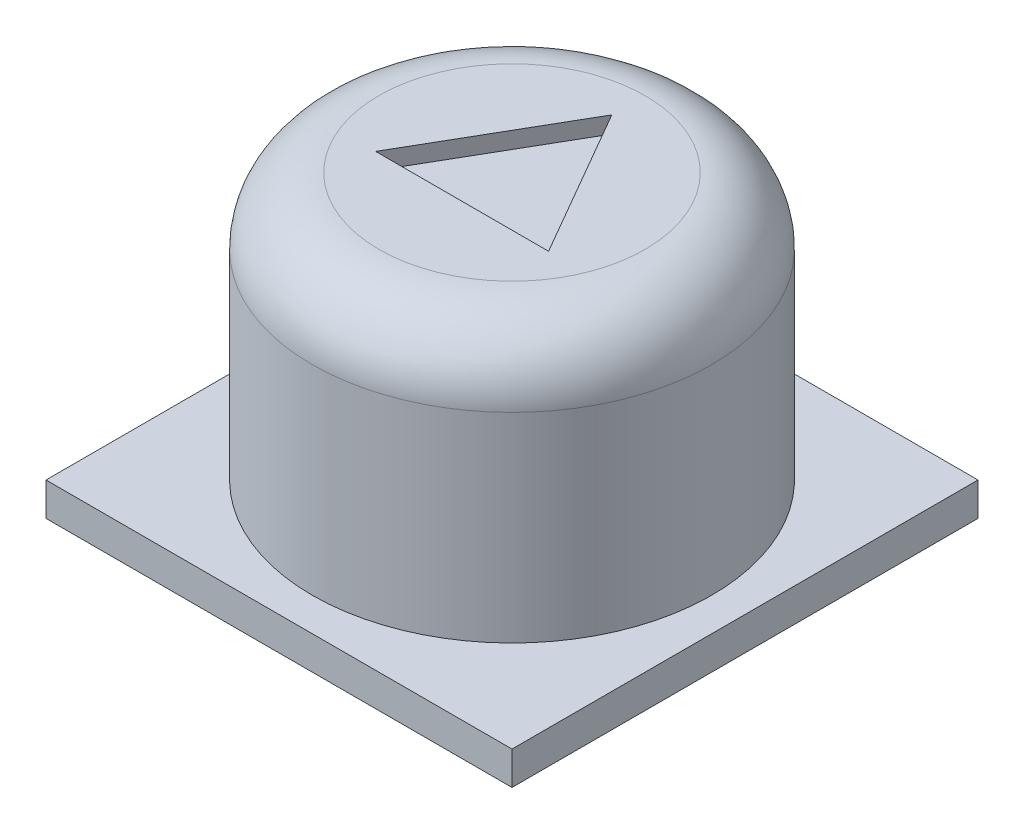
ISO-10303-21;
HEADER;
FILE_DESCRIPTION(('STEP AP214'),'2;1');
FILE_NAME('part.step','',(''),(''),'','','');
FILE_SCHEMA(('AUTOMOTIVE_DESIGN { 1 0 10303 214 1 1 1 1 }'));
ENDSEC;
DATA;
#1=APPLICATION_CONTEXT('core data for automotive mechanical design processes');
#2=APPLICATION_PROTOCOL_DEFINITION('international standard','automotive_design',2000,#1);
#3=PRODUCT_CONTEXT('',#1,'mechanical');
#4=PRODUCT('Part','Part','',(#3));
#5=PRODUCT_RELATED_PRODUCT_CATEGORY('part','',(#4));
#6=PRODUCT_DEFINITION_FORMATION('','',#4);
#7=PRODUCT_DEFINITION_CONTEXT('part definition',#1,'design');
#8=PRODUCT_DEFINITION('design','',#6,#7);
#9=PRODUCT_DEFINITION_SHAPE('','',#8);
#10=(LENGTH_UNIT() NAMED_UNIT(*) SI_UNIT(.MILLI.,.METRE.));
#11=(NAMED_UNIT(*) PLANE_ANGLE_UNIT() SI_UNIT($,.RADIAN.));
#12=(NAMED_UNIT(*) SI_UNIT($,.STERADIAN.) SOLID_ANGLE_UNIT());
#13=UNCERTAINTY_MEASURE_WITH_UNIT(LENGTH_MEASURE(1.E-05),#10,'distance_accuracy_value','');
#14=(GEOMETRIC_REPRESENTATION_CONTEXT(3) GLOBAL_UNCERTAINTY_ASSIGNED_CONTEXT((#13)) GLOBAL_UNIT_ASSIGNED_CONTEXT((#10,
#11,#12)) REPRESENTATION_CONTEXT('',''));
#15=CARTESIAN_POINT('',(0.,0.,0.));
#16=DIRECTION('',(0.,0.,1.));
#17=DIRECTION('',(1.,0.,0.));
#18=AXIS2_PLACEMENT_3D('',#15,#16,#17);
#19=CARTESIAN_POINT('',(0.,0.,0.));
#20=DIRECTION('',(0.,1.,0.));
#21=DIRECTION('',(0.,0.,1.));
#22=AXIS2_PLACEMENT_3D('',#19,#20,#21);
#23=PLANE('',#22);
#24=DIRECTION('',(0.,0.,1.));
#25=VECTOR('',#24,1.);
#26=CARTESIAN_POINT('',(-7.,0.,7.));
#27=LINE('',#26,#25);
#28=CARTESIAN_POINT('',(-7.,0.,-7.));
#29=VERTEX_POINT('',#28);
#30=CARTESIAN_POINT('',(-7.,0.,7.));
#31=VERTEX_POINT('',#30);
#32=EDGE_CURVE('E236',#29,#31,#27,.T.);
#33=ORIENTED_EDGE('',*,*,#32,.F.);
#34=DIRECTION('',(-1.,0.,0.));
#35=VECTOR('',#34,1.);
#36=CARTESIAN_POINT('',(7.,0.,-7.));
#37=LINE('',#36,#35);
#38=CARTESIAN_POINT('',(7.,0.,-7.));
#39=VERTEX_POINT('',#38);
#40=EDGE_CURVE('E241',#39,#29,#37,.T.);
#41=ORIENTED_EDGE('',*,*,#40,.F.);
#42=DIRECTION('',(0.,0.,-1.));
#43=VECTOR('',#42,1.);
#44=CARTESIAN_POINT('',(7.,0.,7.));
#45=LINE('',#44,#43);
#46=CARTESIAN_POINT('',(7.,0.,7.));
#47=VERTEX_POINT('',#46);
#48=EDGE_CURVE('E252',#47,#39,#45,.T.);
#49=ORIENTED_EDGE('',*,*,#48,.F.);
#50=DIRECTION('',(1.,0.,0.));
#51=VECTOR('',#50,1.);
#52=CARTESIAN_POINT('',(7.,0.,7.));
#53=LINE('',#52,#51);
#54=EDGE_CURVE('E250',#31,#47,#53,.T.);
#55=ORIENTED_EDGE('',*,*,#54,.F.);
#56=EDGE_LOOP('',(#33,#41,#49,#55));
#57=FACE_BOUND('',#56,.T.);
#58=DIRECTION('',(0.,0.,-1.));
#59=VECTOR('',#58,1.);
#60=CARTESIAN_POINT('',(-3.,0.,-3.));
#61=LINE('',#60,#59);
#62=CARTESIAN_POINT('',(-3.,0.,3.));
#63=VERTEX_POINT('',#62);
#64=CARTESIAN_POINT('',(-3.,0.,-3.));
#65=VERTEX_POINT('',#64);
#66=EDGE_CURVE('E195',#63,#65,#61,.T.);
#67=ORIENTED_EDGE('',*,*,#66,.F.);
#68=DIRECTION('',(-1.,0.,0.));
#69=VECTOR('',#68,1.);
#70=CARTESIAN_POINT('',(3.,0.,3.));
#71=LINE('',#70,#69);
#72=CARTESIAN_POINT('',(3.,0.,3.));
#73=VERTEX_POINT('',#72);
#74=EDGE_CURVE('E205',#73,#63,#71,.T.);
#75=ORIENTED_EDGE('',*,*,#74,.F.);
#76=DIRECTION('',(0.,0.,1.));
#77=VECTOR('',#76,1.);
#78=CARTESIAN_POINT('',(3.,0.,-3.));
#79=LINE('',#78,#77);
#80=CARTESIAN_POINT('',(3.,0.,-3.));
#81=VERTEX_POINT('',#80);
#82=EDGE_CURVE('E217',#81,#73,#79,.T.);
#83=ORIENTED_EDGE('',*,*,#82,.F.);
#84=DIRECTION('',(1.,0.,0.));
#85=VECTOR('',#84,1.);
#86=CARTESIAN_POINT('',(3.,0.,-3.));
#87=LINE('',#86,#85);
#88=EDGE_CURVE('E214',#65,#81,#87,.T.);
#89=ORIENTED_EDGE('',*,*,#88,.F.);
#90=EDGE_LOOP('',(#67,#75,#83,#89));
#91=FACE_BOUND('',#90,.T.);
#92=ADVANCED_FACE('F34',(#57,#91),#23,.F.);
#93=CARTESIAN_POINT('',(0.,1.,0.));
#94=DIRECTION('',(0.,1.,0.));
#95=DIRECTION('',(0.,0.,1.));
#96=AXIS2_PLACEMENT_3D('',#93,#94,#95);
#97=PLANE('',#96);
#98=DIRECTION('',(0.,0.,1.));
#99=VECTOR('',#98,1.);
#100=CARTESIAN_POINT('',(-7.,1.,7.));
#101=LINE('',#100,#99);
#102=CARTESIAN_POINT('',(-7.,1.,-7.));
#103=VERTEX_POINT('',#102);
#104=CARTESIAN_POINT('',(-7.,1.,7.));
#105=VERTEX_POINT('',#104);
#106=EDGE_CURVE('E237',#103,#105,#101,.T.);
#107=ORIENTED_EDGE('',*,*,#106,.T.);
#108=DIRECTION('',(1.,0.,0.));
#109=VECTOR('',#108,1.);
#110=CARTESIAN_POINT('',(7.,1.,7.));
#111=LINE('',#110,#109);
#112=CARTESIAN_POINT('',(7.,1.,7.));
#113=VERTEX_POINT('',#112);
#114=EDGE_CURVE('E240',#105,#113,#111,.T.);
#115=ORIENTED_EDGE('',*,*,#114,.T.);
#116=DIRECTION('',(0.,0.,-1.));
#117=VECTOR('',#116,1.);
#118=CARTESIAN_POINT('',(7.,1.,7.));
#119=LINE('',#118,#117);
#120=CARTESIAN_POINT('',(7.,1.,-7.));
#121=VERTEX_POINT('',#120);
#122=EDGE_CURVE('E243',#113,#121,#119,.T.);
#123=ORIENTED_EDGE('',*,*,#122,.T.);
#124=DIRECTION('',(-1.,0.,0.));
#125=VECTOR('',#124,1.);
#126=CARTESIAN_POINT('',(7.,1.,-7.));
#127=LINE('',#126,#125);
#128=EDGE_CURVE('E245',#121,#103,#127,.T.);
#129=ORIENTED_EDGE('',*,*,#128,.T.);
#130=EDGE_LOOP('',(#107,#115,#123,#129));
#131=FACE_BOUND('',#130,.T.);
#132=CARTESIAN_POINT('',(0.,1.,0.));
#133=DIRECTION('',(0.,1.,0.));
#134=DIRECTION('',(0.,0.,1.));
#135=AXIS2_PLACEMENT_3D('',#132,#133,#134);
#136=CIRCLE('',#135,6.);
#137=CARTESIAN_POINT('',(0.,1.,6.));
#138=VERTEX_POINT('',#137);
#139=EDGE_CURVE('E233',#138,#138,#136,.T.);
#140=ORIENTED_EDGE('',*,*,#139,.F.);
#141=EDGE_LOOP('',(#140));
#142=FACE_BOUND('',#141,.T.);
#143=ADVANCED_FACE('F284',(#131,#142),#97,.T.);
#144=CARTESIAN_POINT('',(-7.,1.,7.));
#145=DIRECTION('',(1.,0.,0.));
#146=DIRECTION('',(0.,0.,-1.));
#147=AXIS2_PLACEMENT_3D('',#144,#145,#146);
#148=PLANE('',#147);
#149=ORIENTED_EDGE('',*,*,#32,.T.);
#150=DIRECTION('',(0.,-1.,0.));
#151=VECTOR('',#150,1.);
#152=CARTESIAN_POINT('',(-7.,1.,7.));
#153=LINE('',#152,#151);
#154=EDGE_CURVE('E263',#105,#31,#153,.T.);
#155=ORIENTED_EDGE('',*,*,#154,.F.);
#156=ORIENTED_EDGE('',*,*,#106,.F.);
#157=DIRECTION('',(0.,-1.,0.));
#158=VECTOR('',#157,1.);
#159=CARTESIAN_POINT('',(-7.,1.,-7.));
#160=LINE('',#159,#158);
#161=EDGE_CURVE('E247',#103,#29,#160,.T.);
#162=ORIENTED_EDGE('',*,*,#161,.T.);
#163=EDGE_LOOP('',(#149,#155,#156,#162));
#164=FACE_BOUND('',#163,.T.);
#165=ADVANCED_FACE('F290',(#164),#148,.F.);
#166=CARTESIAN_POINT('',(7.,1.,7.));
#167=DIRECTION('',(0.,0.,-1.));
#168=DIRECTION('',(-1.,0.,0.));
#169=AXIS2_PLACEMENT_3D('',#166,#167,#168);
#170=PLANE('',#169);
#171=ORIENTED_EDGE('',*,*,#54,.T.);
#172=DIRECTION('',(0.,-1.,0.));
#173=VECTOR('',#172,1.);
#174=CARTESIAN_POINT('',(7.,1.,7.));
#175=LINE('',#174,#173);
#176=EDGE_CURVE('E260',#113,#47,#175,.T.);
#177=ORIENTED_EDGE('',*,*,#176,.F.);
#178=ORIENTED_EDGE('',*,*,#114,.F.);
#179=ORIENTED_EDGE('',*,*,#154,.T.);
#180=EDGE_LOOP('',(#171,#177,#178,#179));
#181=FACE_BOUND('',#180,.T.);
#182=ADVANCED_FACE('F305',(#181),#170,.F.);
#183=CARTESIAN_POINT('',(7.,1.,7.));
#184=DIRECTION('',(-1.,0.,0.));
#185=DIRECTION('',(0.,0.,1.));
#186=AXIS2_PLACEMENT_3D('',#183,#184,#185);
#187=PLANE('',#186);
#188=ORIENTED_EDGE('',*,*,#48,.T.);
#189=DIRECTION('',(0.,-1.,0.));
#190=VECTOR('',#189,1.);
#191=CARTESIAN_POINT('',(7.,1.,-7.));
#192=LINE('',#191,#190);
#193=EDGE_CURVE('E257',#121,#39,#192,.T.);
#194=ORIENTED_EDGE('',*,*,#193,.F.);
#195=ORIENTED_EDGE('',*,*,#122,.F.);
#196=ORIENTED_EDGE('',*,*,#176,.T.);
#197=EDGE_LOOP('',(#188,#194,#195,#196));
#198=FACE_BOUND('',#197,.T.);
#199=ADVANCED_FACE('F301',(#198),#187,.F.);
#200=CARTESIAN_POINT('',(7.,1.,-7.));
#201=DIRECTION('',(0.,0.,1.));
#202=DIRECTION('',(1.,0.,0.));
#203=AXIS2_PLACEMENT_3D('',#200,#201,#202);
#204=PLANE('',#203);
#205=ORIENTED_EDGE('',*,*,#40,.T.);
#206=ORIENTED_EDGE('',*,*,#161,.F.);
#207=ORIENTED_EDGE('',*,*,#128,.F.);
#208=ORIENTED_EDGE('',*,*,#193,.T.);
#209=EDGE_LOOP('',(#205,#206,#207,#208));
#210=FACE_BOUND('',#209,.T.);
#211=ADVANCED_FACE('F297',(#210),#204,.F.);
#212=CARTESIAN_POINT('',(0.,9.,0.));
#213=DIRECTION('',(0.,-1.,0.));
#214=DIRECTION('',(0.,0.,-1.));
#215=AXIS2_PLACEMENT_3D('',#212,#213,#214);
#216=CYLINDRICAL_SURFACE('',#215,6.);
#217=CARTESIAN_POINT('',(0.,7.,0.));
#218=DIRECTION('',(0.,1.,0.));
#219=DIRECTION('',(0.,0.,1.));
#220=AXIS2_PLACEMENT_3D('',#217,#218,#219);
#221=CIRCLE('',#220,6.);
#222=CARTESIAN_POINT('',(0.,7.,6.));
#223=VERTEX_POINT('',#222);
#224=EDGE_CURVE('E11',#223,#223,#221,.F.);
#225=ORIENTED_EDGE('',*,*,#224,.T.);
#226=EDGE_LOOP('',(#225));
#227=FACE_BOUND('',#226,.T.);
#228=ORIENTED_EDGE('',*,*,#139,.T.);
#229=EDGE_LOOP('',(#228));
#230=FACE_BOUND('',#229,.T.);
#231=ADVANCED_FACE('F300',(#227,#230),#216,.T.);
#232=CARTESIAN_POINT('',(0.,9.,0.));
#233=DIRECTION('',(0.,1.,0.));
#234=DIRECTION('',(0.,0.,1.));
#235=AXIS2_PLACEMENT_3D('',#232,#233,#234);
#236=PLANE('',#235);
#237=DIRECTION('',(-0.5,0.,-0.866025403784438));
#238=VECTOR('',#237,1.);
#239=CARTESIAN_POINT('',(2.59807621135333,9.,1.50000000000001));
#240=LINE('',#239,#238);
#241=CARTESIAN_POINT('',(2.59807621135333,9.,1.50000000000001));
#242=VERTEX_POINT('',#241);
#243=CARTESIAN_POINT('',(0.,9.,-3.00000000000001));
#244=VERTEX_POINT('',#243);
#245=EDGE_CURVE('E49',#242,#244,#240,.T.);
#246=ORIENTED_EDGE('',*,*,#245,.F.);
#247=DIRECTION('',(1.,0.,0.));
#248=VECTOR('',#247,1.);
#249=CARTESIAN_POINT('',(-2.59807621135333,9.,1.50000000000001));
#250=LINE('',#249,#248);
#251=CARTESIAN_POINT('',(-2.59807621135333,9.,1.50000000000001));
#252=VERTEX_POINT('',#251);
#253=EDGE_CURVE('E158',#252,#242,#250,.T.);
#254=ORIENTED_EDGE('',*,*,#253,.F.);
#255=DIRECTION('',(-0.5,0.,0.866025403784439));
#256=VECTOR('',#255,1.);
#257=CARTESIAN_POINT('',(0.,9.,-3.00000000000001));
#258=LINE('',#257,#256);
#259=EDGE_CURVE('E161',#244,#252,#258,.T.);
#260=ORIENTED_EDGE('',*,*,#259,.F.);
#261=EDGE_LOOP('',(#246,#254,#260));
#262=FACE_BOUND('',#261,.T.);
#263=CARTESIAN_POINT('',(0.,9.,0.));
#264=DIRECTION('',(0.,1.,0.));
#265=DIRECTION('',(0.,0.,1.));
#266=AXIS2_PLACEMENT_3D('',#263,#264,#265);
#267=CIRCLE('',#266,4.);
#268=CARTESIAN_POINT('',(0.,9.,4.));
#269=VERTEX_POINT('',#268);
#270=EDGE_CURVE('E42',#269,#269,#267,.T.);
#271=ORIENTED_EDGE('',*,*,#270,.T.);
#272=EDGE_LOOP('',(#271));
#273=FACE_BOUND('',#272,.T.);
#274=ADVANCED_FACE('F268',(#262,#273),#236,.T.);
#275=CARTESIAN_POINT('',(-3.,-2.,-3.));
#276=DIRECTION('',(1.,0.,0.));
#277=DIRECTION('',(0.,0.,-1.));
#278=AXIS2_PLACEMENT_3D('',#275,#276,#277);
#279=PLANE('',#278);
#280=ORIENTED_EDGE('',*,*,#66,.T.);
#281=DIRECTION('',(0.,1.,0.));
#282=VECTOR('',#281,1.);
#283=CARTESIAN_POINT('',(-3.,-2.,-3.));
#284=LINE('',#283,#282);
#285=CARTESIAN_POINT('',(-3.,-2.,-3.));
#286=VERTEX_POINT('',#285);
#287=EDGE_CURVE('E230',#286,#65,#284,.T.);
#288=ORIENTED_EDGE('',*,*,#287,.F.);
#289=DIRECTION('',(0.,0.,-1.));
#290=VECTOR('',#289,1.);
#291=CARTESIAN_POINT('',(-3.,-2.,-3.));
#292=LINE('',#291,#290);
#293=CARTESIAN_POINT('',(-3.,-2.,3.));
#294=VERTEX_POINT('',#293);
#295=EDGE_CURVE('E201',#294,#286,#292,.T.);
#296=ORIENTED_EDGE('',*,*,#295,.F.);
#297=DIRECTION('',(0.,1.,0.));
#298=VECTOR('',#297,1.);
#299=CARTESIAN_POINT('',(-3.,-2.,3.));
#300=LINE('',#299,#298);
#301=EDGE_CURVE('E211',#294,#63,#300,.T.);
#302=ORIENTED_EDGE('',*,*,#301,.T.);
#303=EDGE_LOOP('',(#280,#288,#296,#302));
#304=FACE_BOUND('',#303,.T.);
#305=ADVANCED_FACE('F330',(#304),#279,.F.);
#306=CARTESIAN_POINT('',(3.,-2.,-3.));
#307=DIRECTION('',(0.,0.,1.));
#308=DIRECTION('',(1.,0.,0.));
#309=AXIS2_PLACEMENT_3D('',#306,#307,#308);
#310=PLANE('',#309);
#311=ORIENTED_EDGE('',*,*,#88,.T.);
#312=DIRECTION('',(0.,1.,0.));
#313=VECTOR('',#312,1.);
#314=CARTESIAN_POINT('',(3.,-2.,-3.));
#315=LINE('',#314,#313);
#316=CARTESIAN_POINT('',(3.,-2.,-3.));
#317=VERTEX_POINT('',#316);
#318=EDGE_CURVE('E227',#317,#81,#315,.T.);
#319=ORIENTED_EDGE('',*,*,#318,.F.);
#320=DIRECTION('',(1.,0.,0.));
#321=VECTOR('',#320,1.);
#322=CARTESIAN_POINT('',(3.,-2.,-3.));
#323=LINE('',#322,#321);
#324=EDGE_CURVE('E204',#286,#317,#323,.T.);
#325=ORIENTED_EDGE('',*,*,#324,.F.);
#326=ORIENTED_EDGE('',*,*,#287,.T.);
#327=EDGE_LOOP('',(#311,#319,#325,#326));
#328=FACE_BOUND('',#327,.T.);
#329=ADVANCED_FACE('F336',(#328),#310,.F.);
#330=CARTESIAN_POINT('',(3.,-2.,-3.));
#331=DIRECTION('',(-1.,0.,0.));
#332=DIRECTION('',(0.,0.,1.));
#333=AXIS2_PLACEMENT_3D('',#330,#331,#332);
#334=PLANE('',#333);
#335=ORIENTED_EDGE('',*,*,#82,.T.);
#336=DIRECTION('',(0.,1.,0.));
#337=VECTOR('',#336,1.);
#338=CARTESIAN_POINT('',(3.,-2.,3.));
#339=LINE('',#338,#337);
#340=CARTESIAN_POINT('',(3.,-2.,3.));
#341=VERTEX_POINT('',#340);
#342=EDGE_CURVE('E224',#341,#73,#339,.T.);
#343=ORIENTED_EDGE('',*,*,#342,.F.);
#344=DIRECTION('',(0.,0.,1.));
#345=VECTOR('',#344,1.);
#346=CARTESIAN_POINT('',(3.,-2.,-3.));
#347=LINE('',#346,#345);
#348=EDGE_CURVE('E207',#317,#341,#347,.T.);
#349=ORIENTED_EDGE('',*,*,#348,.F.);
#350=ORIENTED_EDGE('',*,*,#318,.T.);
#351=EDGE_LOOP('',(#335,#343,#349,#350));
#352=FACE_BOUND('',#351,.T.);
#353=ADVANCED_FACE('F340',(#352),#334,.F.);
#354=CARTESIAN_POINT('',(3.,-2.,3.));
#355=DIRECTION('',(0.,0.,-1.));
#356=DIRECTION('',(-1.,0.,0.));
#357=AXIS2_PLACEMENT_3D('',#354,#355,#356);
#358=PLANE('',#357);
#359=ORIENTED_EDGE('',*,*,#74,.T.);
#360=ORIENTED_EDGE('',*,*,#301,.F.);
#361=DIRECTION('',(-1.,0.,0.));
#362=VECTOR('',#361,1.);
#363=CARTESIAN_POINT('',(3.,-2.,3.));
#364=LINE('',#363,#362);
#365=EDGE_CURVE('E209',#341,#294,#364,.T.);
#366=ORIENTED_EDGE('',*,*,#365,.F.);
#367=ORIENTED_EDGE('',*,*,#342,.T.);
#368=EDGE_LOOP('',(#359,#360,#366,#367));
#369=FACE_BOUND('',#368,.T.);
#370=ADVANCED_FACE('F344',(#369),#358,.F.);
#371=CARTESIAN_POINT('',(0.,-2.,0.));
#372=DIRECTION('',(0.,-1.,0.));
#373=DIRECTION('',(0.,0.,-1.));
#374=AXIS2_PLACEMENT_3D('',#371,#372,#373);
#375=PLANE('',#374);
#376=DIRECTION('',(0.,0.,-1.));
#377=VECTOR('',#376,1.);
#378=CARTESIAN_POINT('',(-2.,-2.,-2.));
#379=LINE('',#378,#377);
#380=CARTESIAN_POINT('',(-2.,-2.,2.));
#381=VERTEX_POINT('',#380);
#382=CARTESIAN_POINT('',(-2.,-2.,-2.));
#383=VERTEX_POINT('',#382);
#384=EDGE_CURVE('E57',#381,#383,#379,.T.);
#385=ORIENTED_EDGE('',*,*,#384,.F.);
#386=DIRECTION('',(-1.,0.,0.));
#387=VECTOR('',#386,1.);
#388=CARTESIAN_POINT('',(2.,-2.,2.));
#389=LINE('',#388,#387);
#390=CARTESIAN_POINT('',(2.,-2.,2.));
#391=VERTEX_POINT('',#390);
#392=EDGE_CURVE('E174',#391,#381,#389,.T.);
#393=ORIENTED_EDGE('',*,*,#392,.F.);
#394=DIRECTION('',(0.,0.,1.));
#395=VECTOR('',#394,1.);
#396=CARTESIAN_POINT('',(2.,-2.,-2.));
#397=LINE('',#396,#395);
#398=CARTESIAN_POINT('',(2.,-2.,-2.));
#399=VERTEX_POINT('',#398);
#400=EDGE_CURVE('E188',#399,#391,#397,.T.);
#401=ORIENTED_EDGE('',*,*,#400,.F.);
#402=DIRECTION('',(1.,0.,0.));
#403=VECTOR('',#402,1.);
#404=CARTESIAN_POINT('',(2.,-2.,-2.));
#405=LINE('',#404,#403);
#406=EDGE_CURVE('E185',#383,#399,#405,.T.);
#407=ORIENTED_EDGE('',*,*,#406,.F.);
#408=EDGE_LOOP('',(#385,#393,#401,#407));
#409=FACE_BOUND('',#408,.T.);
#410=ORIENTED_EDGE('',*,*,#295,.T.);
#411=ORIENTED_EDGE('',*,*,#324,.T.);
#412=ORIENTED_EDGE('',*,*,#348,.T.);
#413=ORIENTED_EDGE('',*,*,#365,.T.);
#414=EDGE_LOOP('',(#410,#411,#412,#413));
#415=FACE_BOUND('',#414,.T.);
#416=ADVANCED_FACE('F348',(#409,#415),#375,.T.);
#417=CARTESIAN_POINT('',(-2.,0.,-2.));
#418=DIRECTION('',(-1.,0.,0.));
#419=DIRECTION('',(0.,0.,1.));
#420=AXIS2_PLACEMENT_3D('',#417,#418,#419);
#421=PLANE('',#420);
#422=ORIENTED_EDGE('',*,*,#384,.T.);
#423=DIRECTION('',(0.,-1.,0.));
#424=VECTOR('',#423,1.);
#425=CARTESIAN_POINT('',(-2.,0.,-2.));
#426=LINE('',#425,#424);
#427=CARTESIAN_POINT('',(-2.,0.,-2.));
#428=VERTEX_POINT('',#427);
#429=EDGE_CURVE('E183',#428,#383,#426,.T.);
#430=ORIENTED_EDGE('',*,*,#429,.F.);
#431=DIRECTION('',(0.,0.,-1.));
#432=VECTOR('',#431,1.);
#433=CARTESIAN_POINT('',(-2.,0.,-2.));
#434=LINE('',#433,#432);
#435=CARTESIAN_POINT('',(-2.,0.,2.));
#436=VERTEX_POINT('',#435);
#437=EDGE_CURVE('E170',#436,#428,#434,.T.);
#438=ORIENTED_EDGE('',*,*,#437,.F.);
#439=DIRECTION('',(0.,-1.,0.));
#440=VECTOR('',#439,1.);
#441=CARTESIAN_POINT('',(-2.,0.,2.));
#442=LINE('',#441,#440);
#443=EDGE_CURVE('E193',#436,#381,#442,.T.);
#444=ORIENTED_EDGE('',*,*,#443,.T.);
#445=EDGE_LOOP('',(#422,#430,#438,#444));
#446=FACE_BOUND('',#445,.T.);
#447=ADVANCED_FACE('F352',(#446),#421,.F.);
#448=CARTESIAN_POINT('',(2.,0.,2.));
#449=DIRECTION('',(0.,0.,1.));
#450=DIRECTION('',(1.,0.,0.));
#451=AXIS2_PLACEMENT_3D('',#448,#449,#450);
#452=PLANE('',#451);
#453=ORIENTED_EDGE('',*,*,#392,.T.);
#454=ORIENTED_EDGE('',*,*,#443,.F.);
#455=DIRECTION('',(-1.,0.,0.));
#456=VECTOR('',#455,1.);
#457=CARTESIAN_POINT('',(2.,0.,2.));
#458=LINE('',#457,#456);
#459=CARTESIAN_POINT('',(2.,0.,2.));
#460=VERTEX_POINT('',#459);
#461=EDGE_CURVE('E180',#460,#436,#458,.T.);
#462=ORIENTED_EDGE('',*,*,#461,.F.);
#463=DIRECTION('',(0.,-1.,0.));
#464=VECTOR('',#463,1.);
#465=CARTESIAN_POINT('',(2.,0.,2.));
#466=LINE('',#465,#464);
#467=EDGE_CURVE('E196',#460,#391,#466,.T.);
#468=ORIENTED_EDGE('',*,*,#467,.T.);
#469=EDGE_LOOP('',(#453,#454,#462,#468));
#470=FACE_BOUND('',#469,.T.);
#471=ADVANCED_FACE('F356',(#470),#452,.F.);
#472=CARTESIAN_POINT('',(2.,0.,-2.));
#473=DIRECTION('',(1.,0.,0.));
#474=DIRECTION('',(0.,0.,-1.));
#475=AXIS2_PLACEMENT_3D('',#472,#473,#474);
#476=PLANE('',#475);
#477=ORIENTED_EDGE('',*,*,#400,.T.);
#478=ORIENTED_EDGE('',*,*,#467,.F.);
#479=DIRECTION('',(0.,0.,1.));
#480=VECTOR('',#479,1.);
#481=CARTESIAN_POINT('',(2.,0.,-2.));
#482=LINE('',#481,#480);
#483=CARTESIAN_POINT('',(2.,0.,-2.));
#484=VERTEX_POINT('',#483);
#485=EDGE_CURVE('E177',#484,#460,#482,.T.);
#486=ORIENTED_EDGE('',*,*,#485,.F.);
#487=DIRECTION('',(0.,-1.,0.));
#488=VECTOR('',#487,1.);
#489=CARTESIAN_POINT('',(2.,0.,-2.));
#490=LINE('',#489,#488);
#491=EDGE_CURVE('E198',#484,#399,#490,.T.);
#492=ORIENTED_EDGE('',*,*,#491,.T.);
#493=EDGE_LOOP('',(#477,#478,#486,#492));
#494=FACE_BOUND('',#493,.T.);
#495=ADVANCED_FACE('F359',(#494),#476,.F.);
#496=CARTESIAN_POINT('',(2.,0.,-2.));
#497=DIRECTION('',(0.,0.,-1.));
#498=DIRECTION('',(-1.,0.,0.));
#499=AXIS2_PLACEMENT_3D('',#496,#497,#498);
#500=PLANE('',#499);
#501=ORIENTED_EDGE('',*,*,#406,.T.);
#502=ORIENTED_EDGE('',*,*,#491,.F.);
#503=DIRECTION('',(1.,0.,0.));
#504=VECTOR('',#503,1.);
#505=CARTESIAN_POINT('',(2.,0.,-2.));
#506=LINE('',#505,#504);
#507=EDGE_CURVE('E173',#428,#484,#506,.T.);
#508=ORIENTED_EDGE('',*,*,#507,.F.);
#509=ORIENTED_EDGE('',*,*,#429,.T.);
#510=EDGE_LOOP('',(#501,#502,#508,#509));
#511=FACE_BOUND('',#510,.T.);
#512=ADVANCED_FACE('F279',(#511),#500,.F.);
#513=CARTESIAN_POINT('',(0.,0.,0.));
#514=DIRECTION('',(0.,-1.,0.));
#515=DIRECTION('',(0.,0.,-1.));
#516=AXIS2_PLACEMENT_3D('',#513,#514,#515);
#517=PLANE('',#516);
#518=ORIENTED_EDGE('',*,*,#437,.T.);
#519=ORIENTED_EDGE('',*,*,#507,.T.);
#520=ORIENTED_EDGE('',*,*,#485,.T.);
#521=ORIENTED_EDGE('',*,*,#461,.T.);
#522=EDGE_LOOP('',(#518,#519,#520,#521));
#523=FACE_BOUND('',#522,.T.);
#524=ADVANCED_FACE('F271',(#523),#517,.T.);
#525=CARTESIAN_POINT('',(0.,7.,0.));
#526=DIRECTION('',(0.,1.,0.));
#527=DIRECTION('',(0.,0.,1.));
#528=AXIS2_PLACEMENT_3D('',#525,#526,#527);
#529=TOROIDAL_SURFACE('',#528,4.,2.);
#530=ORIENTED_EDGE('',*,*,#224,.F.);
#531=EDGE_LOOP('',(#530));
#532=FACE_BOUND('',#531,.T.);
#533=ORIENTED_EDGE('',*,*,#270,.F.);
#534=EDGE_LOOP('',(#533));
#535=FACE_BOUND('',#534,.T.);
#536=ADVANCED_FACE('F36',(#532,#535),#529,.T.);
#537=CARTESIAN_POINT('',(2.59807621135333,8.5,1.50000000000001));
#538=DIRECTION('',(0.866025403784439,0.,-0.5));
#539=DIRECTION('',(-0.5,0.,-0.866025403784438));
#540=AXIS2_PLACEMENT_3D('',#537,#538,#539);
#541=PLANE('',#540);
#542=ORIENTED_EDGE('',*,*,#245,.T.);
#543=DIRECTION('',(0.,1.,0.));
#544=VECTOR('',#543,1.);
#545=CARTESIAN_POINT('',(0.,8.5,-3.00000000000001));
#546=LINE('',#545,#544);
#547=CARTESIAN_POINT('',(0.,8.5,-3.00000000000001));
#548=VERTEX_POINT('',#547);
#549=EDGE_CURVE('E139',#548,#244,#546,.T.);
#550=ORIENTED_EDGE('',*,*,#549,.F.);
#551=DIRECTION('',(-0.5,0.,-0.866025403784438));
#552=VECTOR('',#551,1.);
#553=CARTESIAN_POINT('',(2.59807621135333,8.5,1.50000000000001));
#554=LINE('',#553,#552);
#555=CARTESIAN_POINT('',(2.59807621135333,8.5,1.50000000000001));
#556=VERTEX_POINT('',#555);
#557=EDGE_CURVE('E143',#556,#548,#554,.T.);
#558=ORIENTED_EDGE('',*,*,#557,.F.);
#559=DIRECTION('',(0.,1.,0.));
#560=VECTOR('',#559,1.);
#561=CARTESIAN_POINT('',(2.59807621135333,8.5,1.50000000000001));
#562=LINE('',#561,#560);
#563=EDGE_CURVE('E167',#556,#242,#562,.T.);
#564=ORIENTED_EDGE('',*,*,#563,.T.);
#565=EDGE_LOOP('',(#542,#550,#558,#564));
#566=FACE_BOUND('',#565,.T.);
#567=ADVANCED_FACE('F141',(#566),#541,.F.);
#568=CARTESIAN_POINT('',(-2.59807621135333,8.5,1.50000000000001));
#569=DIRECTION('',(0.,0.,1.));
#570=DIRECTION('',(1.,0.,0.));
#571=AXIS2_PLACEMENT_3D('',#568,#569,#570);
#572=PLANE('',#571);
#573=ORIENTED_EDGE('',*,*,#253,.T.);
#574=ORIENTED_EDGE('',*,*,#563,.F.);
#575=DIRECTION('',(1.,0.,0.));
#576=VECTOR('',#575,1.);
#577=CARTESIAN_POINT('',(-2.59807621135333,8.5,1.50000000000001));
#578=LINE('',#577,#576);
#579=CARTESIAN_POINT('',(-2.59807621135333,8.5,1.50000000000001));
#580=VERTEX_POINT('',#579);
#581=EDGE_CURVE('E149',#580,#556,#578,.T.);
#582=ORIENTED_EDGE('',*,*,#581,.F.);
#583=DIRECTION('',(0.,1.,0.));
#584=VECTOR('',#583,1.);
#585=CARTESIAN_POINT('',(-2.59807621135333,8.5,1.50000000000001));
#586=LINE('',#585,#584);
#587=EDGE_CURVE('E148',#580,#252,#586,.T.);
#588=ORIENTED_EDGE('',*,*,#587,.T.);
#589=EDGE_LOOP('',(#573,#574,#582,#588));
#590=FACE_BOUND('',#589,.T.);
#591=ADVANCED_FACE('F277',(#590),#572,.F.);
#592=CARTESIAN_POINT('',(0.,8.5,-3.00000000000001));
#593=DIRECTION('',(-0.866025403784439,0.,-0.5));
#594=DIRECTION('',(-0.5,0.,0.866025403784439));
#595=AXIS2_PLACEMENT_3D('',#592,#593,#594);
#596=PLANE('',#595);
#597=ORIENTED_EDGE('',*,*,#259,.T.);
#598=ORIENTED_EDGE('',*,*,#587,.F.);
#599=DIRECTION('',(-0.5,0.,0.866025403784439));
#600=VECTOR('',#599,1.);
#601=CARTESIAN_POINT('',(0.,8.5,-3.00000000000001));
#602=LINE('',#601,#600);
#603=EDGE_CURVE('E152',#548,#580,#602,.T.);
#604=ORIENTED_EDGE('',*,*,#603,.F.);
#605=ORIENTED_EDGE('',*,*,#549,.T.);
#606=EDGE_LOOP('',(#597,#598,#604,#605));
#607=FACE_BOUND('',#606,.T.);
#608=ADVANCED_FACE('F153',(#607),#596,.F.);
#609=CARTESIAN_POINT('',(0.,8.5,0.));
#610=DIRECTION('',(0.,1.,0.));
#611=DIRECTION('',(0.,0.,1.));
#612=AXIS2_PLACEMENT_3D('',#609,#610,#611);
#613=PLANE('',#612);
#614=ORIENTED_EDGE('',*,*,#557,.T.);
#615=ORIENTED_EDGE('',*,*,#603,.T.);
#616=ORIENTED_EDGE('',*,*,#581,.T.);
#617=EDGE_LOOP('',(#614,#615,#616));
#618=FACE_BOUND('',#617,.T.);
#619=ADVANCED_FACE('F157',(#618),#613,.T.);
#620=CLOSED_SHELL('',(#92,#143,#165,#182,#199,#211,#231,#274,#305,#329,#353,#370,#416,#447,#471,
#495,#512,#524,#536,#567,#591,#608,#619));
#621=MANIFOLD_SOLID_BREP('B2',#620);
#622=ADVANCED_BREP_SHAPE_REPRESENTATION('',(#18,#621),#14);
#623=SHAPE_DEFINITION_REPRESENTATION(#9,#622);
ENDSEC;
END-ISO-10303-21;
